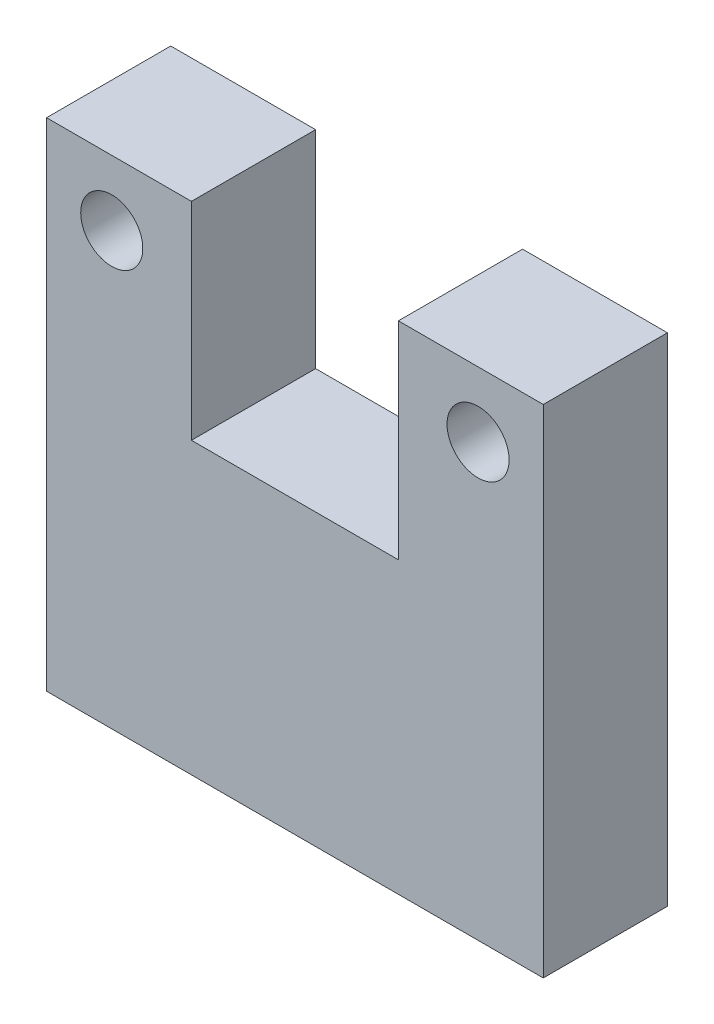
ISO-10303-21;
HEADER;
FILE_DESCRIPTION(('STEP AP214'),'2;1');
FILE_NAME('part.step','',(''),(''),'','','');
FILE_SCHEMA(('AUTOMOTIVE_DESIGN { 1 0 10303 214 1 1 1 1 }'));
ENDSEC;
DATA;
#1=APPLICATION_CONTEXT('core data for automotive mechanical design processes');
#2=APPLICATION_PROTOCOL_DEFINITION('international standard','automotive_design',2000,#1);
#3=PRODUCT_CONTEXT('',#1,'mechanical');
#4=PRODUCT('Part','Part','',(#3));
#5=PRODUCT_RELATED_PRODUCT_CATEGORY('part','',(#4));
#6=PRODUCT_DEFINITION_FORMATION('','',#4);
#7=PRODUCT_DEFINITION_CONTEXT('part definition',#1,'design');
#8=PRODUCT_DEFINITION('design','',#6,#7);
#9=PRODUCT_DEFINITION_SHAPE('','',#8);
#10=(LENGTH_UNIT() NAMED_UNIT(*) SI_UNIT(.MILLI.,.METRE.));
#11=(NAMED_UNIT(*) PLANE_ANGLE_UNIT() SI_UNIT($,.RADIAN.));
#12=(NAMED_UNIT(*) SI_UNIT($,.STERADIAN.) SOLID_ANGLE_UNIT());
#13=UNCERTAINTY_MEASURE_WITH_UNIT(LENGTH_MEASURE(1.E-05),#10,'distance_accuracy_value','');
#14=(GEOMETRIC_REPRESENTATION_CONTEXT(3) GLOBAL_UNCERTAINTY_ASSIGNED_CONTEXT((#13)) GLOBAL_UNIT_ASSIGNED_CONTEXT((#10,
#11,#12)) REPRESENTATION_CONTEXT('',''));
#15=CARTESIAN_POINT('',(0.,0.,0.));
#16=DIRECTION('',(0.,0.,1.));
#17=DIRECTION('',(1.,0.,0.));
#18=AXIS2_PLACEMENT_3D('',#15,#16,#17);
#19=CARTESIAN_POINT('',(127.,0.,152.4));
#20=DIRECTION('',(-1.,0.,0.));
#21=DIRECTION('',(0.,0.,1.));
#22=AXIS2_PLACEMENT_3D('',#19,#20,#21);
#23=PLANE('',#22);
#24=DIRECTION('',(0.,1.,0.));
#25=VECTOR('',#24,1.);
#26=CARTESIAN_POINT('',(127.,0.,0.));
#27=LINE('',#26,#25);
#28=CARTESIAN_POINT('',(127.,50.8,0.));
#29=VERTEX_POINT('',#28);
#30=CARTESIAN_POINT('',(127.,304.8,0.));
#31=VERTEX_POINT('',#30);
#32=EDGE_CURVE('E138',#29,#31,#27,.T.);
#33=ORIENTED_EDGE('',*,*,#32,.F.);
#34=DIRECTION('',(0.,0.,-1.));
#35=VECTOR('',#34,1.);
#36=CARTESIAN_POINT('',(127.,50.8,152.4));
#37=LINE('',#36,#35);
#38=CARTESIAN_POINT('',(127.,50.8,152.4));
#39=VERTEX_POINT('',#38);
#40=EDGE_CURVE('E11',#39,#29,#37,.T.);
#41=ORIENTED_EDGE('',*,*,#40,.F.);
#42=DIRECTION('',(0.,1.,0.));
#43=VECTOR('',#42,1.);
#44=CARTESIAN_POINT('',(127.,0.,152.4));
#45=LINE('',#44,#43);
#46=CARTESIAN_POINT('',(127.,304.8,152.4));
#47=VERTEX_POINT('',#46);
#48=EDGE_CURVE('E187',#39,#47,#45,.T.);
#49=ORIENTED_EDGE('',*,*,#48,.T.);
#50=DIRECTION('',(0.,0.,-1.));
#51=VECTOR('',#50,1.);
#52=CARTESIAN_POINT('',(127.,304.8,152.4));
#53=LINE('',#52,#51);
#54=EDGE_CURVE('E89',#47,#31,#53,.T.);
#55=ORIENTED_EDGE('',*,*,#54,.T.);
#56=EDGE_LOOP('',(#33,#41,#49,#55));
#57=FACE_BOUND('',#56,.T.);
#58=ADVANCED_FACE('F38',(#57),#23,.T.);
#59=CARTESIAN_POINT('',(0.,50.8,152.4));
#60=DIRECTION('',(0.,1.,0.));
#61=DIRECTION('',(0.,0.,1.));
#62=AXIS2_PLACEMENT_3D('',#59,#60,#61);
#63=PLANE('',#62);
#64=DIRECTION('',(1.,0.,0.));
#65=VECTOR('',#64,1.);
#66=CARTESIAN_POINT('',(0.,50.8,0.));
#67=LINE('',#66,#65);
#68=CARTESIAN_POINT('',(-127.,50.8,0.));
#69=VERTEX_POINT('',#68);
#70=EDGE_CURVE('E141',#69,#29,#67,.T.);
#71=ORIENTED_EDGE('',*,*,#70,.F.);
#72=DIRECTION('',(0.,0.,-1.));
#73=VECTOR('',#72,1.);
#74=CARTESIAN_POINT('',(-127.,50.8,152.4));
#75=LINE('',#74,#73);
#76=CARTESIAN_POINT('',(-127.,50.8,152.4));
#77=VERTEX_POINT('',#76);
#78=EDGE_CURVE('E47',#77,#69,#75,.T.);
#79=ORIENTED_EDGE('',*,*,#78,.F.);
#80=DIRECTION('',(1.,0.,0.));
#81=VECTOR('',#80,1.);
#82=CARTESIAN_POINT('',(0.,50.8,152.4));
#83=LINE('',#82,#81);
#84=EDGE_CURVE('E179',#77,#39,#83,.T.);
#85=ORIENTED_EDGE('',*,*,#84,.T.);
#86=ORIENTED_EDGE('',*,*,#40,.T.);
#87=EDGE_LOOP('',(#71,#79,#85,#86));
#88=FACE_BOUND('',#87,.T.);
#89=ADVANCED_FACE('F178',(#88),#63,.T.);
#90=CARTESIAN_POINT('',(-127.,0.,152.4));
#91=DIRECTION('',(-1.,0.,0.));
#92=DIRECTION('',(0.,0.,1.));
#93=AXIS2_PLACEMENT_3D('',#90,#91,#92);
#94=PLANE('',#93);
#95=DIRECTION('',(0.,1.,0.));
#96=VECTOR('',#95,1.);
#97=CARTESIAN_POINT('',(-127.,0.,0.));
#98=LINE('',#97,#96);
#99=CARTESIAN_POINT('',(-127.,304.8,0.));
#100=VERTEX_POINT('',#99);
#101=EDGE_CURVE('E144',#69,#100,#98,.T.);
#102=ORIENTED_EDGE('',*,*,#101,.T.);
#103=DIRECTION('',(0.,0.,-1.));
#104=VECTOR('',#103,1.);
#105=CARTESIAN_POINT('',(-127.,304.8,152.4));
#106=LINE('',#105,#104);
#107=CARTESIAN_POINT('',(-127.,304.8,152.4));
#108=VERTEX_POINT('',#107);
#109=EDGE_CURVE('E163',#108,#100,#106,.T.);
#110=ORIENTED_EDGE('',*,*,#109,.F.);
#111=DIRECTION('',(0.,1.,0.));
#112=VECTOR('',#111,1.);
#113=CARTESIAN_POINT('',(-127.,0.,152.4));
#114=LINE('',#113,#112);
#115=EDGE_CURVE('E171',#77,#108,#114,.T.);
#116=ORIENTED_EDGE('',*,*,#115,.F.);
#117=ORIENTED_EDGE('',*,*,#78,.T.);
#118=EDGE_LOOP('',(#102,#110,#116,#117));
#119=FACE_BOUND('',#118,.T.);
#120=ADVANCED_FACE('F168',(#119),#94,.F.);
#121=CARTESIAN_POINT('',(0.,304.8,152.4));
#122=DIRECTION('',(0.,-1.,0.));
#123=DIRECTION('',(1.,0.,0.));
#124=AXIS2_PLACEMENT_3D('',#121,#122,#123);
#125=PLANE('',#124);
#126=DIRECTION('',(-1.,0.,0.));
#127=VECTOR('',#126,1.);
#128=CARTESIAN_POINT('',(0.,304.8,0.));
#129=LINE('',#128,#127);
#130=CARTESIAN_POINT('',(-304.8,304.8,0.));
#131=VERTEX_POINT('',#130);
#132=EDGE_CURVE('E147',#100,#131,#129,.T.);
#133=ORIENTED_EDGE('',*,*,#132,.T.);
#134=DIRECTION('',(0.,0.,-1.));
#135=VECTOR('',#134,1.);
#136=CARTESIAN_POINT('',(-304.8,304.8,152.4));
#137=LINE('',#136,#135);
#138=CARTESIAN_POINT('',(-304.8,304.8,152.4));
#139=VERTEX_POINT('',#138);
#140=EDGE_CURVE('E160',#139,#131,#137,.T.);
#141=ORIENTED_EDGE('',*,*,#140,.F.);
#142=DIRECTION('',(-1.,0.,0.));
#143=VECTOR('',#142,1.);
#144=CARTESIAN_POINT('',(0.,304.8,152.4));
#145=LINE('',#144,#143);
#146=EDGE_CURVE('E129',#108,#139,#145,.T.);
#147=ORIENTED_EDGE('',*,*,#146,.F.);
#148=ORIENTED_EDGE('',*,*,#109,.T.);
#149=EDGE_LOOP('',(#133,#141,#147,#148));
#150=FACE_BOUND('',#149,.T.);
#151=ADVANCED_FACE('F194',(#150),#125,.F.);
#152=CARTESIAN_POINT('',(-304.8,0.,152.4));
#153=DIRECTION('',(1.,0.,0.));
#154=DIRECTION('',(0.,1.,0.));
#155=AXIS2_PLACEMENT_3D('',#152,#153,#154);
#156=PLANE('',#155);
#157=DIRECTION('',(0.,-1.,0.));
#158=VECTOR('',#157,1.);
#159=CARTESIAN_POINT('',(-304.8,0.,0.));
#160=LINE('',#159,#158);
#161=CARTESIAN_POINT('',(-304.8,-304.8,0.));
#162=VERTEX_POINT('',#161);
#163=EDGE_CURVE('E150',#131,#162,#160,.T.);
#164=ORIENTED_EDGE('',*,*,#163,.T.);
#165=DIRECTION('',(0.,0.,-1.));
#166=VECTOR('',#165,1.);
#167=CARTESIAN_POINT('',(-304.8,-304.8,152.4));
#168=LINE('',#167,#166);
#169=CARTESIAN_POINT('',(-304.8,-304.8,152.4));
#170=VERTEX_POINT('',#169);
#171=EDGE_CURVE('E118',#170,#162,#168,.T.);
#172=ORIENTED_EDGE('',*,*,#171,.F.);
#173=DIRECTION('',(0.,-1.,0.));
#174=VECTOR('',#173,1.);
#175=CARTESIAN_POINT('',(-304.8,0.,152.4));
#176=LINE('',#175,#174);
#177=EDGE_CURVE('E123',#139,#170,#176,.T.);
#178=ORIENTED_EDGE('',*,*,#177,.F.);
#179=ORIENTED_EDGE('',*,*,#140,.T.);
#180=EDGE_LOOP('',(#164,#172,#178,#179));
#181=FACE_BOUND('',#180,.T.);
#182=ADVANCED_FACE('F196',(#181),#156,.F.);
#183=CARTESIAN_POINT('',(0.,-304.8,152.4));
#184=DIRECTION('',(0.,-1.,0.));
#185=DIRECTION('',(1.,0.,0.));
#186=AXIS2_PLACEMENT_3D('',#183,#184,#185);
#187=PLANE('',#186);
#188=DIRECTION('',(-1.,0.,0.));
#189=VECTOR('',#188,1.);
#190=CARTESIAN_POINT('',(0.,-304.8,0.));
#191=LINE('',#190,#189);
#192=CARTESIAN_POINT('',(304.8,-304.8,0.));
#193=VERTEX_POINT('',#192);
#194=EDGE_CURVE('E113',#193,#162,#191,.T.);
#195=ORIENTED_EDGE('',*,*,#194,.F.);
#196=DIRECTION('',(0.,0.,-1.));
#197=VECTOR('',#196,1.);
#198=CARTESIAN_POINT('',(304.8,-304.8,152.4));
#199=LINE('',#198,#197);
#200=CARTESIAN_POINT('',(304.8,-304.8,152.4));
#201=VERTEX_POINT('',#200);
#202=EDGE_CURVE('E108',#201,#193,#199,.T.);
#203=ORIENTED_EDGE('',*,*,#202,.F.);
#204=DIRECTION('',(-1.,0.,0.));
#205=VECTOR('',#204,1.);
#206=CARTESIAN_POINT('',(0.,-304.8,152.4));
#207=LINE('',#206,#205);
#208=EDGE_CURVE('E111',#201,#170,#207,.T.);
#209=ORIENTED_EDGE('',*,*,#208,.T.);
#210=ORIENTED_EDGE('',*,*,#171,.T.);
#211=EDGE_LOOP('',(#195,#203,#209,#210));
#212=FACE_BOUND('',#211,.T.);
#213=ADVANCED_FACE('F110',(#212),#187,.T.);
#214=CARTESIAN_POINT('',(304.8,0.,152.4));
#215=DIRECTION('',(1.,0.,0.));
#216=DIRECTION('',(0.,1.,0.));
#217=AXIS2_PLACEMENT_3D('',#214,#215,#216);
#218=PLANE('',#217);
#219=DIRECTION('',(0.,-1.,0.));
#220=VECTOR('',#219,1.);
#221=CARTESIAN_POINT('',(304.8,0.,0.));
#222=LINE('',#221,#220);
#223=CARTESIAN_POINT('',(304.8,304.8,0.));
#224=VERTEX_POINT('',#223);
#225=EDGE_CURVE('E155',#224,#193,#222,.T.);
#226=ORIENTED_EDGE('',*,*,#225,.F.);
#227=DIRECTION('',(0.,0.,-1.));
#228=VECTOR('',#227,1.);
#229=CARTESIAN_POINT('',(304.8,304.8,152.4));
#230=LINE('',#229,#228);
#231=CARTESIAN_POINT('',(304.8,304.8,152.4));
#232=VERTEX_POINT('',#231);
#233=EDGE_CURVE('E82',#232,#224,#230,.T.);
#234=ORIENTED_EDGE('',*,*,#233,.F.);
#235=DIRECTION('',(0.,-1.,0.));
#236=VECTOR('',#235,1.);
#237=CARTESIAN_POINT('',(304.8,0.,152.4));
#238=LINE('',#237,#236);
#239=EDGE_CURVE('E121',#232,#201,#238,.T.);
#240=ORIENTED_EDGE('',*,*,#239,.T.);
#241=ORIENTED_EDGE('',*,*,#202,.T.);
#242=EDGE_LOOP('',(#226,#234,#240,#241));
#243=FACE_BOUND('',#242,.T.);
#244=ADVANCED_FACE('F126',(#243),#218,.T.);
#245=CARTESIAN_POINT('',(-224.8,224.8,152.4));
#246=DIRECTION('',(0.,0.,-1.));
#247=DIRECTION('',(-1.,0.,0.));
#248=AXIS2_PLACEMENT_3D('',#245,#246,#247);
#249=CYLINDRICAL_SURFACE('',#248,38.1);
#250=CARTESIAN_POINT('',(-224.8,224.8,152.4));
#251=DIRECTION('',(0.,0.,1.));
#252=DIRECTION('',(1.,0.,0.));
#253=AXIS2_PLACEMENT_3D('',#250,#251,#252);
#254=CIRCLE('',#253,38.1);
#255=CARTESIAN_POINT('',(-262.9,224.8,152.4));
#256=VERTEX_POINT('',#255);
#257=EDGE_CURVE('E182',#256,#256,#254,.T.);
#258=CARTESIAN_POINT('',(-224.8,224.8,0.));
#259=DIRECTION('',(0.,0.,1.));
#260=DIRECTION('',(1.,0.,0.));
#261=AXIS2_PLACEMENT_3D('',#258,#259,#260);
#262=CIRCLE('',#261,38.1);
#263=CARTESIAN_POINT('',(-262.9,224.8,0.));
#264=VERTEX_POINT('',#263);
#265=EDGE_CURVE('E135',#264,#264,#262,.T.);
#266=CARTESIAN_POINT('',(-262.9,224.8,152.4));
#267=CARTESIAN_POINT('',(-262.9,224.8,150.8125));
#268=CARTESIAN_POINT('',(-262.9,224.8,149.225));
#269=CARTESIAN_POINT('',(-262.9,224.8,146.05));
#270=CARTESIAN_POINT('',(-262.9,224.8,144.4625));
#271=CARTESIAN_POINT('',(-262.9,224.8,141.2875));
#272=CARTESIAN_POINT('',(-262.9,224.8,139.7));
#273=CARTESIAN_POINT('',(-262.9,224.8,136.525));
#274=CARTESIAN_POINT('',(-262.9,224.8,134.9375));
#275=CARTESIAN_POINT('',(-262.9,224.8,131.7625));
#276=CARTESIAN_POINT('',(-262.9,224.8,130.175));
#277=CARTESIAN_POINT('',(-262.9,224.8,127.));
#278=CARTESIAN_POINT('',(-262.9,224.8,125.4125));
#279=CARTESIAN_POINT('',(-262.9,224.8,122.2375));
#280=CARTESIAN_POINT('',(-262.9,224.8,120.65));
#281=CARTESIAN_POINT('',(-262.9,224.8,117.475));
#282=CARTESIAN_POINT('',(-262.9,224.8,115.8875));
#283=CARTESIAN_POINT('',(-262.9,224.8,112.7125));
#284=CARTESIAN_POINT('',(-262.9,224.8,111.125));
#285=CARTESIAN_POINT('',(-262.9,224.8,107.95));
#286=CARTESIAN_POINT('',(-262.9,224.8,106.3625));
#287=CARTESIAN_POINT('',(-262.9,224.8,103.1875));
#288=CARTESIAN_POINT('',(-262.9,224.8,101.6));
#289=CARTESIAN_POINT('',(-262.9,224.8,98.425));
#290=CARTESIAN_POINT('',(-262.9,224.8,96.8375));
#291=CARTESIAN_POINT('',(-262.9,224.8,93.6625));
#292=CARTESIAN_POINT('',(-262.9,224.8,92.075));
#293=CARTESIAN_POINT('',(-262.9,224.8,88.9));
#294=CARTESIAN_POINT('',(-262.9,224.8,87.3125));
#295=CARTESIAN_POINT('',(-262.9,224.8,84.1375));
#296=CARTESIAN_POINT('',(-262.9,224.8,82.55));
#297=CARTESIAN_POINT('',(-262.9,224.8,79.375));
#298=CARTESIAN_POINT('',(-262.9,224.8,77.7875));
#299=CARTESIAN_POINT('',(-262.9,224.8,74.6125));
#300=CARTESIAN_POINT('',(-262.9,224.8,73.025));
#301=CARTESIAN_POINT('',(-262.9,224.8,69.85));
#302=CARTESIAN_POINT('',(-262.9,224.8,68.2625));
#303=CARTESIAN_POINT('',(-262.9,224.8,65.0875));
#304=CARTESIAN_POINT('',(-262.9,224.8,63.5));
#305=CARTESIAN_POINT('',(-262.9,224.8,60.325));
#306=CARTESIAN_POINT('',(-262.9,224.8,58.7375));
#307=CARTESIAN_POINT('',(-262.9,224.8,55.5625));
#308=CARTESIAN_POINT('',(-262.9,224.8,53.975));
#309=CARTESIAN_POINT('',(-262.9,224.8,50.8));
#310=CARTESIAN_POINT('',(-262.9,224.8,49.2125));
#311=CARTESIAN_POINT('',(-262.9,224.8,46.0375));
#312=CARTESIAN_POINT('',(-262.9,224.8,44.45));
#313=CARTESIAN_POINT('',(-262.9,224.8,41.275));
#314=CARTESIAN_POINT('',(-262.9,224.8,39.6875));
#315=CARTESIAN_POINT('',(-262.9,224.8,36.5125));
#316=CARTESIAN_POINT('',(-262.9,224.8,34.925));
#317=CARTESIAN_POINT('',(-262.9,224.8,31.75));
#318=CARTESIAN_POINT('',(-262.9,224.8,30.1625));
#319=CARTESIAN_POINT('',(-262.9,224.8,26.9875));
#320=CARTESIAN_POINT('',(-262.9,224.8,25.4));
#321=CARTESIAN_POINT('',(-262.9,224.8,22.225));
#322=CARTESIAN_POINT('',(-262.9,224.8,20.6375));
#323=CARTESIAN_POINT('',(-262.9,224.8,17.4625));
#324=CARTESIAN_POINT('',(-262.9,224.8,15.875));
#325=CARTESIAN_POINT('',(-262.9,224.8,12.7));
#326=CARTESIAN_POINT('',(-262.9,224.8,11.1125));
#327=CARTESIAN_POINT('',(-262.9,224.8,7.93750000000001));
#328=CARTESIAN_POINT('',(-262.9,224.8,6.35));
#329=CARTESIAN_POINT('',(-262.9,224.8,3.175));
#330=CARTESIAN_POINT('',(-262.9,224.8,1.5875));
#331=CARTESIAN_POINT('',(-262.9,224.8,0.));
#332=B_SPLINE_CURVE_WITH_KNOTS('',3,(#266,#267,#268,#269,#270,#271,#272,#273,#274,#275,#276,
#277,#278,#279,#280,#281,#282,#283,#284,#285,#286,#287,#288,#289,#290,#291,#292,#293,#294,#295,
#296,#297,#298,#299,#300,#301,#302,#303,#304,#305,#306,#307,#308,#309,#310,#311,#312,#313,#314,
#315,#316,#317,#318,#319,#320,#321,#322,#323,#324,#325,#326,#327,#328,#329,#330,#331),
.UNSPECIFIED.,.F.,.F.,(4,2,2,2,2,2,2,2,2,2,2,2,2,2,2,2,2,2,2,2,2,2,2,2,2,2,2,2,2,2,2,2,4),(0.,
4.7625,9.52500000000001,14.2875,19.05,23.8125,28.575,33.3375,38.1,42.8625,47.625,52.3875,57.15,
61.9125,66.675,71.4375,76.2,80.9625,85.725,90.4875,95.25,100.0125,104.775,109.5375,114.3,
119.0625,123.825,128.5875,133.35,138.1125,142.875,147.6375,152.4),.UNSPECIFIED.);
#333=EDGE_CURVE('BSEAM213',#256,#264,#332,.T.);
#334=ORIENTED_EDGE('',*,*,#257,.T.);
#335=ORIENTED_EDGE('',*,*,#265,.F.);
#336=ORIENTED_EDGE('',*,*,#333,.T.);
#337=ORIENTED_EDGE('',*,*,#333,.F.);
#338=EDGE_LOOP('',(#334,#336,#335,#337));
#339=FACE_BOUND('',#338,.T.);
#340=ADVANCED_FACE('F213',(#339),#249,.F.);
#341=CARTESIAN_POINT('',(224.8,224.8,152.4));
#342=DIRECTION('',(0.,0.,-1.));
#343=DIRECTION('',(-1.,0.,0.));
#344=AXIS2_PLACEMENT_3D('',#341,#342,#343);
#345=CYLINDRICAL_SURFACE('',#344,38.1);
#346=CARTESIAN_POINT('',(224.8,224.8,152.4));
#347=DIRECTION('',(0.,0.,1.));
#348=DIRECTION('',(1.,0.,0.));
#349=AXIS2_PLACEMENT_3D('',#346,#347,#348);
#350=CIRCLE('',#349,38.1);
#351=CARTESIAN_POINT('',(186.7,224.8,152.4));
#352=VERTEX_POINT('',#351);
#353=EDGE_CURVE('E180',#352,#352,#350,.T.);
#354=CARTESIAN_POINT('',(224.8,224.8,0.));
#355=DIRECTION('',(0.,0.,1.));
#356=DIRECTION('',(1.,0.,0.));
#357=AXIS2_PLACEMENT_3D('',#354,#355,#356);
#358=CIRCLE('',#357,38.1);
#359=CARTESIAN_POINT('',(186.7,224.8,0.));
#360=VERTEX_POINT('',#359);
#361=EDGE_CURVE('E132',#360,#360,#358,.T.);
#362=CARTESIAN_POINT('',(186.7,224.8,152.4));
#363=CARTESIAN_POINT('',(186.7,224.8,150.8125));
#364=CARTESIAN_POINT('',(186.7,224.8,149.225));
#365=CARTESIAN_POINT('',(186.7,224.8,146.05));
#366=CARTESIAN_POINT('',(186.7,224.8,144.4625));
#367=CARTESIAN_POINT('',(186.7,224.8,141.2875));
#368=CARTESIAN_POINT('',(186.7,224.8,139.7));
#369=CARTESIAN_POINT('',(186.7,224.8,136.525));
#370=CARTESIAN_POINT('',(186.7,224.8,134.9375));
#371=CARTESIAN_POINT('',(186.7,224.8,131.7625));
#372=CARTESIAN_POINT('',(186.7,224.8,130.175));
#373=CARTESIAN_POINT('',(186.7,224.8,127.));
#374=CARTESIAN_POINT('',(186.7,224.8,125.4125));
#375=CARTESIAN_POINT('',(186.7,224.8,122.2375));
#376=CARTESIAN_POINT('',(186.7,224.8,120.65));
#377=CARTESIAN_POINT('',(186.7,224.8,117.475));
#378=CARTESIAN_POINT('',(186.7,224.8,115.8875));
#379=CARTESIAN_POINT('',(186.7,224.8,112.7125));
#380=CARTESIAN_POINT('',(186.7,224.8,111.125));
#381=CARTESIAN_POINT('',(186.7,224.8,107.95));
#382=CARTESIAN_POINT('',(186.7,224.8,106.3625));
#383=CARTESIAN_POINT('',(186.7,224.8,103.1875));
#384=CARTESIAN_POINT('',(186.7,224.8,101.6));
#385=CARTESIAN_POINT('',(186.7,224.8,98.425));
#386=CARTESIAN_POINT('',(186.7,224.8,96.8375));
#387=CARTESIAN_POINT('',(186.7,224.8,93.6625));
#388=CARTESIAN_POINT('',(186.7,224.8,92.075));
#389=CARTESIAN_POINT('',(186.7,224.8,88.9));
#390=CARTESIAN_POINT('',(186.7,224.8,87.3125));
#391=CARTESIAN_POINT('',(186.7,224.8,84.1375));
#392=CARTESIAN_POINT('',(186.7,224.8,82.55));
#393=CARTESIAN_POINT('',(186.7,224.8,79.375));
#394=CARTESIAN_POINT('',(186.7,224.8,77.7875));
#395=CARTESIAN_POINT('',(186.7,224.8,74.6125));
#396=CARTESIAN_POINT('',(186.7,224.8,73.025));
#397=CARTESIAN_POINT('',(186.7,224.8,69.85));
#398=CARTESIAN_POINT('',(186.7,224.8,68.2625));
#399=CARTESIAN_POINT('',(186.7,224.8,65.0875));
#400=CARTESIAN_POINT('',(186.7,224.8,63.5));
#401=CARTESIAN_POINT('',(186.7,224.8,60.325));
#402=CARTESIAN_POINT('',(186.7,224.8,58.7375));
#403=CARTESIAN_POINT('',(186.7,224.8,55.5625));
#404=CARTESIAN_POINT('',(186.7,224.8,53.975));
#405=CARTESIAN_POINT('',(186.7,224.8,50.8));
#406=CARTESIAN_POINT('',(186.7,224.8,49.2125));
#407=CARTESIAN_POINT('',(186.7,224.8,46.0375));
#408=CARTESIAN_POINT('',(186.7,224.8,44.45));
#409=CARTESIAN_POINT('',(186.7,224.8,41.275));
#410=CARTESIAN_POINT('',(186.7,224.8,39.6875));
#411=CARTESIAN_POINT('',(186.7,224.8,36.5125));
#412=CARTESIAN_POINT('',(186.7,224.8,34.925));
#413=CARTESIAN_POINT('',(186.7,224.8,31.75));
#414=CARTESIAN_POINT('',(186.7,224.8,30.1625));
#415=CARTESIAN_POINT('',(186.7,224.8,26.9875));
#416=CARTESIAN_POINT('',(186.7,224.8,25.4));
#417=CARTESIAN_POINT('',(186.7,224.8,22.225));
#418=CARTESIAN_POINT('',(186.7,224.8,20.6375));
#419=CARTESIAN_POINT('',(186.7,224.8,17.4625));
#420=CARTESIAN_POINT('',(186.7,224.8,15.875));
#421=CARTESIAN_POINT('',(186.7,224.8,12.7));
#422=CARTESIAN_POINT('',(186.7,224.8,11.1125));
#423=CARTESIAN_POINT('',(186.7,224.8,7.93750000000001));
#424=CARTESIAN_POINT('',(186.7,224.8,6.35));
#425=CARTESIAN_POINT('',(186.7,224.8,3.175));
#426=CARTESIAN_POINT('',(186.7,224.8,1.5875));
#427=CARTESIAN_POINT('',(186.7,224.8,0.));
#428=B_SPLINE_CURVE_WITH_KNOTS('',3,(#362,#363,#364,#365,#366,#367,#368,#369,#370,#371,#372,
#373,#374,#375,#376,#377,#378,#379,#380,#381,#382,#383,#384,#385,#386,#387,#388,#389,#390,#391,
#392,#393,#394,#395,#396,#397,#398,#399,#400,#401,#402,#403,#404,#405,#406,#407,#408,#409,#410,
#411,#412,#413,#414,#415,#416,#417,#418,#419,#420,#421,#422,#423,#424,#425,#426,#427),
.UNSPECIFIED.,.F.,.F.,(4,2,2,2,2,2,2,2,2,2,2,2,2,2,2,2,2,2,2,2,2,2,2,2,2,2,2,2,2,2,2,2,4),(0.,
4.7625,9.52500000000001,14.2875,19.05,23.8125,28.575,33.3375,38.1,42.8625,47.625,52.3875,57.15,
61.9125,66.675,71.4375,76.2,80.9625,85.725,90.4875,95.25,100.0125,104.775,109.5375,114.3,
119.0625,123.825,128.5875,133.35,138.1125,142.875,147.6375,152.4),.UNSPECIFIED.);
#429=EDGE_CURVE('BSEAM40',#352,#360,#428,.T.);
#430=ORIENTED_EDGE('',*,*,#353,.T.);
#431=ORIENTED_EDGE('',*,*,#361,.F.);
#432=ORIENTED_EDGE('',*,*,#429,.T.);
#433=ORIENTED_EDGE('',*,*,#429,.F.);
#434=EDGE_LOOP('',(#430,#432,#431,#433));
#435=FACE_BOUND('',#434,.T.);
#436=ADVANCED_FACE('F40',(#435),#345,.F.);
#437=EDGE_CURVE('E151',#224,#31,#129,.T.);
#438=ORIENTED_EDGE('',*,*,#437,.T.);
#439=ORIENTED_EDGE('',*,*,#54,.F.);
#440=EDGE_CURVE('E55',#232,#47,#145,.T.);
#441=ORIENTED_EDGE('',*,*,#440,.F.);
#442=ORIENTED_EDGE('',*,*,#233,.T.);
#443=EDGE_LOOP('',(#438,#439,#441,#442));
#444=FACE_BOUND('',#443,.T.);
#445=ADVANCED_FACE('F205',(#444),#125,.F.);
#446=CARTESIAN_POINT('',(0.,0.,152.4));
#447=DIRECTION('',(0.,0.,1.));
#448=DIRECTION('',(1.,0.,0.));
#449=AXIS2_PLACEMENT_3D('',#446,#447,#448);
#450=PLANE('',#449);
#451=ORIENTED_EDGE('',*,*,#353,.F.);
#452=EDGE_LOOP('',(#451));
#453=FACE_BOUND('',#452,.T.);
#454=ORIENTED_EDGE('',*,*,#257,.F.);
#455=EDGE_LOOP('',(#454));
#456=FACE_BOUND('',#455,.T.);
#457=ORIENTED_EDGE('',*,*,#48,.F.);
#458=ORIENTED_EDGE('',*,*,#84,.F.);
#459=ORIENTED_EDGE('',*,*,#115,.T.);
#460=ORIENTED_EDGE('',*,*,#146,.T.);
#461=ORIENTED_EDGE('',*,*,#177,.T.);
#462=ORIENTED_EDGE('',*,*,#208,.F.);
#463=ORIENTED_EDGE('',*,*,#239,.F.);
#464=ORIENTED_EDGE('',*,*,#440,.T.);
#465=EDGE_LOOP('',(#457,#458,#459,#460,#461,#462,#463,#464));
#466=FACE_BOUND('',#465,.T.);
#467=ADVANCED_FACE('F120',(#453,#456,#466),#450,.T.);
#468=CARTESIAN_POINT('',(0.,0.,0.));
#469=DIRECTION('',(0.,0.,1.));
#470=DIRECTION('',(1.,0.,0.));
#471=AXIS2_PLACEMENT_3D('',#468,#469,#470);
#472=PLANE('',#471);
#473=ORIENTED_EDGE('',*,*,#361,.T.);
#474=EDGE_LOOP('',(#473));
#475=FACE_BOUND('',#474,.T.);
#476=ORIENTED_EDGE('',*,*,#265,.T.);
#477=EDGE_LOOP('',(#476));
#478=FACE_BOUND('',#477,.T.);
#479=ORIENTED_EDGE('',*,*,#32,.T.);
#480=ORIENTED_EDGE('',*,*,#437,.F.);
#481=ORIENTED_EDGE('',*,*,#225,.T.);
#482=ORIENTED_EDGE('',*,*,#194,.T.);
#483=ORIENTED_EDGE('',*,*,#163,.F.);
#484=ORIENTED_EDGE('',*,*,#132,.F.);
#485=ORIENTED_EDGE('',*,*,#101,.F.);
#486=ORIENTED_EDGE('',*,*,#70,.T.);
#487=EDGE_LOOP('',(#479,#480,#481,#482,#483,#484,#485,#486));
#488=FACE_BOUND('',#487,.T.);
#489=ADVANCED_FACE('F177',(#475,#478,#488),#472,.F.);
#490=CLOSED_SHELL('',(#58,#89,#120,#151,#182,#213,#244,#340,#436,#445,#467,#489));
#491=MANIFOLD_SOLID_BREP('B2',#490);
#492=ADVANCED_BREP_SHAPE_REPRESENTATION('',(#18,#491),#14);
#493=SHAPE_DEFINITION_REPRESENTATION(#9,#492);
ENDSEC;
END-ISO-10303-21;
